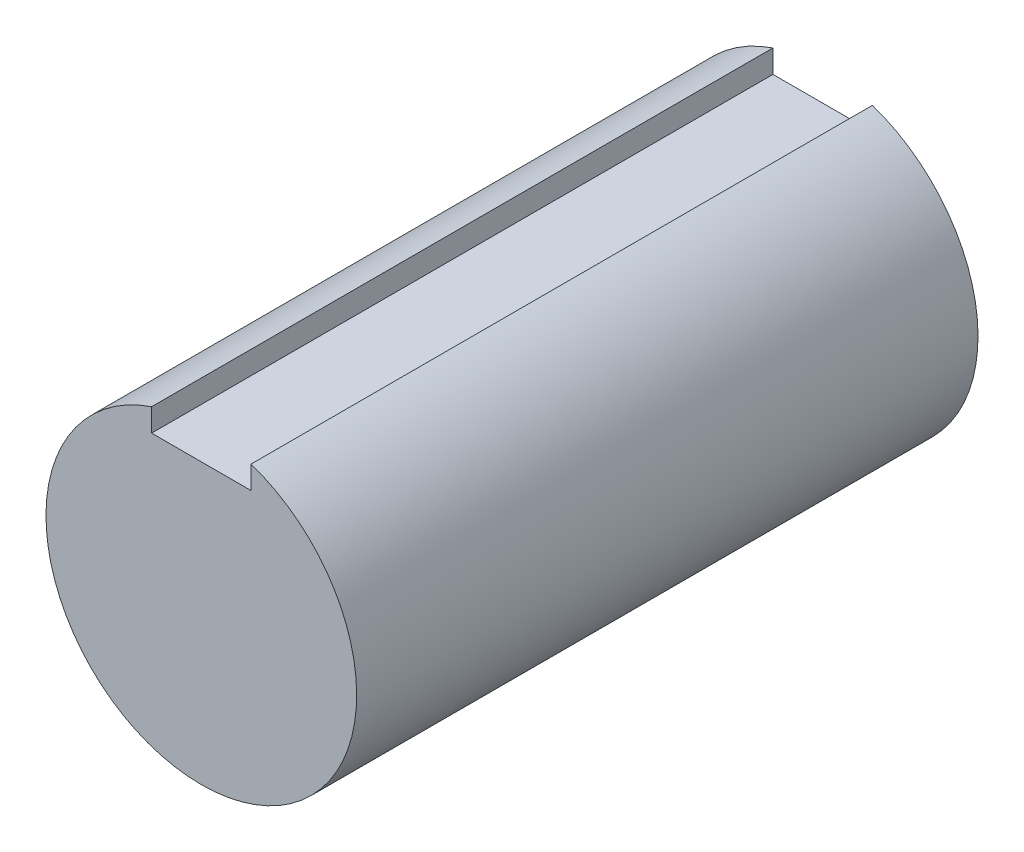
ISO-10303-21;
HEADER;
FILE_DESCRIPTION(('STEP AP214'),'2;1');
FILE_NAME('part.step','',(''),(''),'','','');
FILE_SCHEMA(('AUTOMOTIVE_DESIGN { 1 0 10303 214 1 1 1 1 }'));
ENDSEC;
DATA;
#1=APPLICATION_CONTEXT('core data for automotive mechanical design processes');
#2=APPLICATION_PROTOCOL_DEFINITION('international standard','automotive_design',2000,#1);
#3=PRODUCT_CONTEXT('',#1,'mechanical');
#4=PRODUCT('Part','Part','',(#3));
#5=PRODUCT_RELATED_PRODUCT_CATEGORY('part','',(#4));
#6=PRODUCT_DEFINITION_FORMATION('','',#4);
#7=PRODUCT_DEFINITION_CONTEXT('part definition',#1,'design');
#8=PRODUCT_DEFINITION('design','',#6,#7);
#9=PRODUCT_DEFINITION_SHAPE('','',#8);
#10=(LENGTH_UNIT() NAMED_UNIT(*) SI_UNIT(.MILLI.,.METRE.));
#11=(NAMED_UNIT(*) PLANE_ANGLE_UNIT() SI_UNIT($,.RADIAN.));
#12=(NAMED_UNIT(*) SI_UNIT($,.STERADIAN.) SOLID_ANGLE_UNIT());
#13=UNCERTAINTY_MEASURE_WITH_UNIT(LENGTH_MEASURE(1.E-05),#10,'distance_accuracy_value','');
#14=(GEOMETRIC_REPRESENTATION_CONTEXT(3) GLOBAL_UNCERTAINTY_ASSIGNED_CONTEXT((#13)) GLOBAL_UNIT_ASSIGNED_CONTEXT((#10,
#11,#12)) REPRESENTATION_CONTEXT('',''));
#15=CARTESIAN_POINT('',(0.,0.,0.));
#16=DIRECTION('',(0.,0.,1.));
#17=DIRECTION('',(1.,0.,0.));
#18=AXIS2_PLACEMENT_3D('',#15,#16,#17);
#19=CARTESIAN_POINT('',(0.,0.,100.));
#20=DIRECTION('',(0.,0.,-1.));
#21=DIRECTION('',(-1.,0.,0.));
#22=AXIS2_PLACEMENT_3D('',#19,#20,#21);
#23=CYLINDRICAL_SURFACE('',#22,25.);
#24=DIRECTION('',(0.,0.,1.));
#25=VECTOR('',#24,1.);
#26=CARTESIAN_POINT('',(-8.,23.685438564654,-146.));
#27=LINE('',#26,#25);
#28=CARTESIAN_POINT('',(-8.,23.685438564654,0.));
#29=VERTEX_POINT('',#28);
#30=CARTESIAN_POINT('',(-8.,23.685438564654,100.));
#31=VERTEX_POINT('',#30);
#32=EDGE_CURVE('E94',#29,#31,#27,.T.);
#33=ORIENTED_EDGE('',*,*,#32,.F.);
#34=CARTESIAN_POINT('',(0.,0.,0.));
#35=DIRECTION('',(0.,0.,1.));
#36=DIRECTION('',(1.,0.,0.));
#37=AXIS2_PLACEMENT_3D('',#34,#35,#36);
#38=CIRCLE('',#37,25.);
#39=CARTESIAN_POINT('',(8.,23.685438564654,0.));
#40=VERTEX_POINT('',#39);
#41=EDGE_CURVE('E93',#29,#40,#38,.T.);
#42=ORIENTED_EDGE('',*,*,#41,.T.);
#43=DIRECTION('',(0.,0.,1.));
#44=VECTOR('',#43,1.);
#45=CARTESIAN_POINT('',(8.,23.685438564654,-146.));
#46=LINE('',#45,#44);
#47=CARTESIAN_POINT('',(8.,23.685438564654,100.));
#48=VERTEX_POINT('',#47);
#49=EDGE_CURVE('E47',#40,#48,#46,.T.);
#50=ORIENTED_EDGE('',*,*,#49,.T.);
#51=CARTESIAN_POINT('',(0.,0.,100.));
#52=DIRECTION('',(0.,0.,1.));
#53=DIRECTION('',(1.,0.,0.));
#54=AXIS2_PLACEMENT_3D('',#51,#52,#53);
#55=CIRCLE('',#54,25.);
#56=EDGE_CURVE('E88',#31,#48,#55,.T.);
#57=ORIENTED_EDGE('',*,*,#56,.F.);
#58=EDGE_LOOP('',(#33,#42,#50,#57));
#59=FACE_BOUND('',#58,.T.);
#60=ADVANCED_FACE('F33',(#59),#23,.T.);
#61=CARTESIAN_POINT('',(0.,0.,100.));
#62=DIRECTION('',(0.,0.,1.));
#63=DIRECTION('',(1.,0.,0.));
#64=AXIS2_PLACEMENT_3D('',#61,#62,#63);
#65=PLANE('',#64);
#66=DIRECTION('',(1.,0.,0.));
#67=VECTOR('',#66,1.);
#68=CARTESIAN_POINT('',(0.,20.,100.));
#69=LINE('',#68,#67);
#70=CARTESIAN_POINT('',(-8.,20.,100.));
#71=VERTEX_POINT('',#70);
#72=CARTESIAN_POINT('',(8.,20.,100.));
#73=VERTEX_POINT('',#72);
#74=EDGE_CURVE('E78',#71,#73,#69,.T.);
#75=ORIENTED_EDGE('',*,*,#74,.F.);
#76=DIRECTION('',(0.,1.,0.));
#77=VECTOR('',#76,1.);
#78=CARTESIAN_POINT('',(-8.,0.,100.));
#79=LINE('',#78,#77);
#80=EDGE_CURVE('E75',#71,#31,#79,.T.);
#81=ORIENTED_EDGE('',*,*,#80,.T.);
#82=ORIENTED_EDGE('',*,*,#56,.T.);
#83=DIRECTION('',(0.,1.,0.));
#84=VECTOR('',#83,1.);
#85=CARTESIAN_POINT('',(8.,0.,100.));
#86=LINE('',#85,#84);
#87=EDGE_CURVE('E73',#73,#48,#86,.T.);
#88=ORIENTED_EDGE('',*,*,#87,.F.);
#89=EDGE_LOOP('',(#75,#81,#82,#88));
#90=FACE_BOUND('',#89,.T.);
#91=ADVANCED_FACE('F86',(#90),#65,.T.);
#92=CARTESIAN_POINT('',(0.,0.,0.));
#93=DIRECTION('',(0.,0.,1.));
#94=DIRECTION('',(1.,0.,0.));
#95=AXIS2_PLACEMENT_3D('',#92,#93,#94);
#96=PLANE('',#95);
#97=DIRECTION('',(0.,1.,0.));
#98=VECTOR('',#97,1.);
#99=CARTESIAN_POINT('',(-8.,0.,0.));
#100=LINE('',#99,#98);
#101=CARTESIAN_POINT('',(-8.,20.,0.));
#102=VERTEX_POINT('',#101);
#103=EDGE_CURVE('E11',#102,#29,#100,.T.);
#104=ORIENTED_EDGE('',*,*,#103,.F.);
#105=DIRECTION('',(1.,0.,0.));
#106=VECTOR('',#105,1.);
#107=CARTESIAN_POINT('',(0.,20.,0.));
#108=LINE('',#107,#106);
#109=CARTESIAN_POINT('',(8.,20.,0.));
#110=VERTEX_POINT('',#109);
#111=EDGE_CURVE('E40',#102,#110,#108,.T.);
#112=ORIENTED_EDGE('',*,*,#111,.T.);
#113=DIRECTION('',(0.,1.,0.));
#114=VECTOR('',#113,1.);
#115=CARTESIAN_POINT('',(8.,0.,0.));
#116=LINE('',#115,#114);
#117=EDGE_CURVE('E74',#110,#40,#116,.T.);
#118=ORIENTED_EDGE('',*,*,#117,.T.);
#119=ORIENTED_EDGE('',*,*,#41,.F.);
#120=EDGE_LOOP('',(#104,#112,#118,#119));
#121=FACE_BOUND('',#120,.T.);
#122=ADVANCED_FACE('F102',(#121),#96,.F.);
#123=CARTESIAN_POINT('',(0.,20.,-146.));
#124=DIRECTION('',(0.,-1.,0.));
#125=DIRECTION('',(1.,0.,0.));
#126=AXIS2_PLACEMENT_3D('',#123,#124,#125);
#127=PLANE('',#126);
#128=DIRECTION('',(0.,0.,1.));
#129=VECTOR('',#128,1.);
#130=CARTESIAN_POINT('',(-8.,20.,-146.));
#131=LINE('',#130,#129);
#132=EDGE_CURVE('E80',#102,#71,#131,.T.);
#133=ORIENTED_EDGE('',*,*,#132,.T.);
#134=ORIENTED_EDGE('',*,*,#74,.T.);
#135=DIRECTION('',(0.,0.,1.));
#136=VECTOR('',#135,1.);
#137=CARTESIAN_POINT('',(8.,20.,-146.));
#138=LINE('',#137,#136);
#139=EDGE_CURVE('E69',#110,#73,#138,.T.);
#140=ORIENTED_EDGE('',*,*,#139,.F.);
#141=ORIENTED_EDGE('',*,*,#111,.F.);
#142=EDGE_LOOP('',(#133,#134,#140,#141));
#143=FACE_BOUND('',#142,.T.);
#144=ADVANCED_FACE('F79',(#143),#127,.F.);
#145=CARTESIAN_POINT('',(-8.,0.,-146.));
#146=DIRECTION('',(1.,0.,0.));
#147=DIRECTION('',(0.,0.,-1.));
#148=AXIS2_PLACEMENT_3D('',#145,#146,#147);
#149=PLANE('',#148);
#150=ORIENTED_EDGE('',*,*,#103,.T.);
#151=ORIENTED_EDGE('',*,*,#32,.T.);
#152=ORIENTED_EDGE('',*,*,#80,.F.);
#153=ORIENTED_EDGE('',*,*,#132,.F.);
#154=EDGE_LOOP('',(#150,#151,#152,#153));
#155=FACE_BOUND('',#154,.T.);
#156=ADVANCED_FACE('F106',(#155),#149,.T.);
#157=CARTESIAN_POINT('',(8.,0.,-146.));
#158=DIRECTION('',(1.,0.,0.));
#159=DIRECTION('',(0.,0.,-1.));
#160=AXIS2_PLACEMENT_3D('',#157,#158,#159);
#161=PLANE('',#160);
#162=ORIENTED_EDGE('',*,*,#139,.T.);
#163=ORIENTED_EDGE('',*,*,#87,.T.);
#164=ORIENTED_EDGE('',*,*,#49,.F.);
#165=ORIENTED_EDGE('',*,*,#117,.F.);
#166=EDGE_LOOP('',(#162,#163,#164,#165));
#167=FACE_BOUND('',#166,.T.);
#168=ADVANCED_FACE('F71',(#167),#161,.F.);
#169=CLOSED_SHELL('',(#60,#91,#122,#144,#156,#168));
#170=MANIFOLD_SOLID_BREP('B2',#169);
#171=ADVANCED_BREP_SHAPE_REPRESENTATION('',(#18,#170),#14);
#172=SHAPE_DEFINITION_REPRESENTATION(#9,#171);
ENDSEC;
END-ISO-10303-21;
